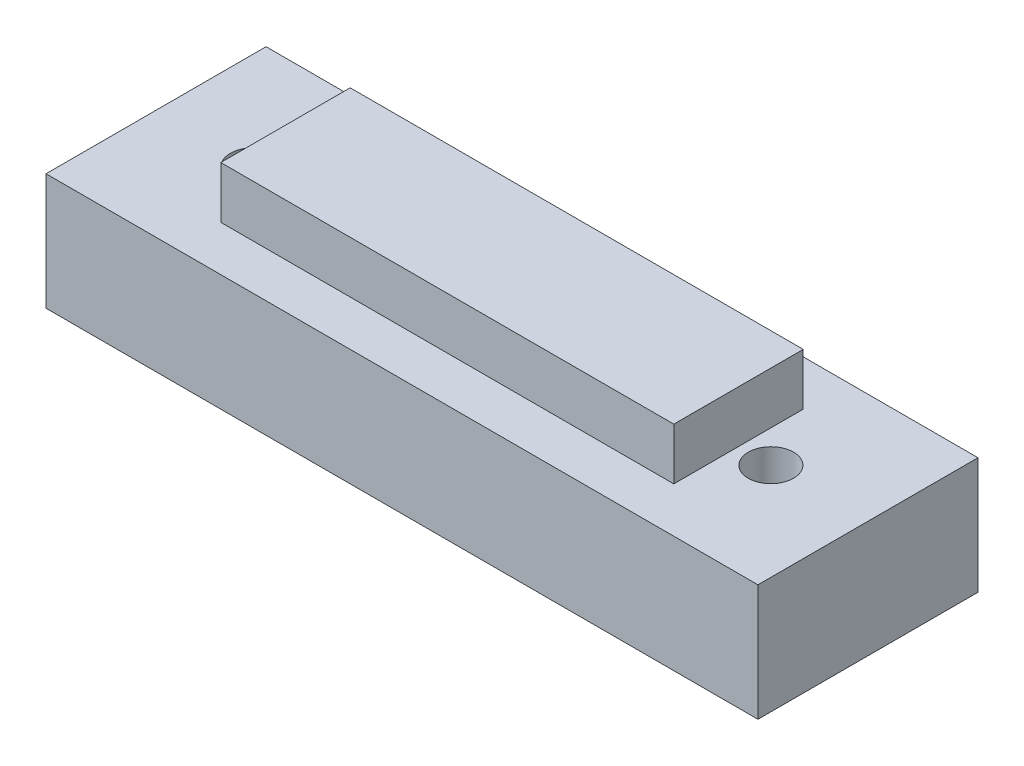
ISO-10303-21;
HEADER;
FILE_DESCRIPTION(('STEP AP214'),'2;1');
FILE_NAME('part.step','',(''),(''),'','','');
FILE_SCHEMA(('AUTOMOTIVE_DESIGN { 1 0 10303 214 1 1 1 1 }'));
ENDSEC;
DATA;
#1=APPLICATION_CONTEXT('core data for automotive mechanical design processes');
#2=APPLICATION_PROTOCOL_DEFINITION('international standard','automotive_design',2000,#1);
#3=PRODUCT_CONTEXT('',#1,'mechanical');
#4=PRODUCT('Part','Part','',(#3));
#5=PRODUCT_RELATED_PRODUCT_CATEGORY('part','',(#4));
#6=PRODUCT_DEFINITION_FORMATION('','',#4);
#7=PRODUCT_DEFINITION_CONTEXT('part definition',#1,'design');
#8=PRODUCT_DEFINITION('design','',#6,#7);
#9=PRODUCT_DEFINITION_SHAPE('','',#8);
#10=(LENGTH_UNIT() NAMED_UNIT(*) SI_UNIT(.MILLI.,.METRE.));
#11=(NAMED_UNIT(*) PLANE_ANGLE_UNIT() SI_UNIT($,.RADIAN.));
#12=(NAMED_UNIT(*) SI_UNIT($,.STERADIAN.) SOLID_ANGLE_UNIT());
#13=UNCERTAINTY_MEASURE_WITH_UNIT(LENGTH_MEASURE(1.E-05),#10,'distance_accuracy_value','');
#14=(GEOMETRIC_REPRESENTATION_CONTEXT(3) GLOBAL_UNCERTAINTY_ASSIGNED_CONTEXT((#13)) GLOBAL_UNIT_ASSIGNED_CONTEXT((#10,
#11,#12)) REPRESENTATION_CONTEXT('',''));
#15=CARTESIAN_POINT('',(0.,0.,0.));
#16=DIRECTION('',(0.,0.,1.));
#17=DIRECTION('',(1.,0.,0.));
#18=AXIS2_PLACEMENT_3D('',#15,#16,#17);
#19=CARTESIAN_POINT('',(0.,18.,0.));
#20=DIRECTION('',(0.,-1.,0.));
#21=DIRECTION('',(0.,0.,-1.));
#22=AXIS2_PLACEMENT_3D('',#19,#20,#21);
#23=PLANE('',#22);
#24=CARTESIAN_POINT('',(40.,18.,0.));
#25=DIRECTION('',(0.,1.,0.));
#26=DIRECTION('',(0.,0.,1.));
#27=AXIS2_PLACEMENT_3D('',#24,#25,#26);
#28=CIRCLE('',#27,3.5);
#29=CARTESIAN_POINT('',(40.,18.,3.5));
#30=VERTEX_POINT('',#29);
#31=EDGE_CURVE('E136',#30,#30,#28,.T.);
#32=ORIENTED_EDGE('',*,*,#31,.F.);
#33=EDGE_LOOP('',(#32));
#34=FACE_BOUND('',#33,.T.);
#35=CARTESIAN_POINT('',(-40.,18.,0.));
#36=DIRECTION('',(0.,1.,0.));
#37=DIRECTION('',(0.,0.,1.));
#38=AXIS2_PLACEMENT_3D('',#35,#36,#37);
#39=CIRCLE('',#38,3.5);
#40=CARTESIAN_POINT('',(-40.,18.,3.5));
#41=VERTEX_POINT('',#40);
#42=EDGE_CURVE('E142',#41,#41,#39,.T.);
#43=ORIENTED_EDGE('',*,*,#42,.F.);
#44=EDGE_LOOP('',(#43));
#45=FACE_BOUND('',#44,.T.);
#46=DIRECTION('',(0.,0.,-1.));
#47=VECTOR('',#46,1.);
#48=CARTESIAN_POINT('',(55.,18.,17.));
#49=LINE('',#48,#47);
#50=CARTESIAN_POINT('',(55.,18.,17.));
#51=VERTEX_POINT('',#50);
#52=CARTESIAN_POINT('',(55.,18.,-17.));
#53=VERTEX_POINT('',#52);
#54=EDGE_CURVE('E148',#51,#53,#49,.T.);
#55=ORIENTED_EDGE('',*,*,#54,.T.);
#56=DIRECTION('',(-1.,0.,0.));
#57=VECTOR('',#56,1.);
#58=CARTESIAN_POINT('',(-55.,18.,-17.));
#59=LINE('',#58,#57);
#60=CARTESIAN_POINT('',(-55.,18.,-17.));
#61=VERTEX_POINT('',#60);
#62=EDGE_CURVE('E151',#53,#61,#59,.T.);
#63=ORIENTED_EDGE('',*,*,#62,.T.);
#64=DIRECTION('',(0.,0.,1.));
#65=VECTOR('',#64,1.);
#66=CARTESIAN_POINT('',(-55.,18.,17.));
#67=LINE('',#66,#65);
#68=CARTESIAN_POINT('',(-55.,18.,17.));
#69=VERTEX_POINT('',#68);
#70=EDGE_CURVE('E154',#61,#69,#67,.T.);
#71=ORIENTED_EDGE('',*,*,#70,.T.);
#72=DIRECTION('',(1.,0.,0.));
#73=VECTOR('',#72,1.);
#74=CARTESIAN_POINT('',(-55.,18.,17.));
#75=LINE('',#74,#73);
#76=EDGE_CURVE('E156',#69,#51,#75,.T.);
#77=ORIENTED_EDGE('',*,*,#76,.T.);
#78=EDGE_LOOP('',(#55,#63,#71,#77));
#79=FACE_BOUND('',#78,.T.);
#80=DIRECTION('',(0.,0.,-1.));
#81=VECTOR('',#80,1.);
#82=CARTESIAN_POINT('',(35.,18.,0.));
#83=LINE('',#82,#81);
#84=CARTESIAN_POINT('',(35.,18.,10.));
#85=VERTEX_POINT('',#84);
#86=CARTESIAN_POINT('',(35.,18.,-10.));
#87=VERTEX_POINT('',#86);
#88=EDGE_CURVE('E123',#85,#87,#83,.T.);
#89=ORIENTED_EDGE('',*,*,#88,.F.);
#90=DIRECTION('',(1.,0.,0.));
#91=VECTOR('',#90,1.);
#92=CARTESIAN_POINT('',(0.,18.,10.));
#93=LINE('',#92,#91);
#94=CARTESIAN_POINT('',(-35.,18.,10.));
#95=VERTEX_POINT('',#94);
#96=EDGE_CURVE('E124',#95,#85,#93,.T.);
#97=ORIENTED_EDGE('',*,*,#96,.F.);
#98=DIRECTION('',(0.,0.,1.));
#99=VECTOR('',#98,1.);
#100=CARTESIAN_POINT('',(-35.,18.,0.));
#101=LINE('',#100,#99);
#102=CARTESIAN_POINT('',(-35.,18.,-10.));
#103=VERTEX_POINT('',#102);
#104=EDGE_CURVE('E59',#103,#95,#101,.T.);
#105=ORIENTED_EDGE('',*,*,#104,.F.);
#106=DIRECTION('',(-1.,0.,0.));
#107=VECTOR('',#106,1.);
#108=CARTESIAN_POINT('',(0.,18.,-10.));
#109=LINE('',#108,#107);
#110=EDGE_CURVE('E54',#87,#103,#109,.T.);
#111=ORIENTED_EDGE('',*,*,#110,.F.);
#112=EDGE_LOOP('',(#89,#97,#105,#111));
#113=FACE_BOUND('',#112,.T.);
#114=ADVANCED_FACE('F39',(#34,#45,#79,#113),#23,.F.);
#115=CARTESIAN_POINT('',(0.,0.,0.));
#116=DIRECTION('',(0.,-1.,0.));
#117=DIRECTION('',(0.,0.,-1.));
#118=AXIS2_PLACEMENT_3D('',#115,#116,#117);
#119=PLANE('',#118);
#120=CARTESIAN_POINT('',(-40.,0.,0.));
#121=DIRECTION('',(0.,1.,0.));
#122=DIRECTION('',(0.,0.,1.));
#123=AXIS2_PLACEMENT_3D('',#120,#121,#122);
#124=CIRCLE('',#123,3.5);
#125=CARTESIAN_POINT('',(-40.,0.,3.5));
#126=VERTEX_POINT('',#125);
#127=EDGE_CURVE('E139',#126,#126,#124,.T.);
#128=ORIENTED_EDGE('',*,*,#127,.T.);
#129=EDGE_LOOP('',(#128));
#130=FACE_BOUND('',#129,.T.);
#131=DIRECTION('',(0.,0.,-1.));
#132=VECTOR('',#131,1.);
#133=CARTESIAN_POINT('',(55.,0.,17.));
#134=LINE('',#133,#132);
#135=CARTESIAN_POINT('',(55.,0.,17.));
#136=VERTEX_POINT('',#135);
#137=CARTESIAN_POINT('',(55.,0.,-17.));
#138=VERTEX_POINT('',#137);
#139=EDGE_CURVE('E145',#136,#138,#134,.T.);
#140=ORIENTED_EDGE('',*,*,#139,.F.);
#141=DIRECTION('',(1.,0.,0.));
#142=VECTOR('',#141,1.);
#143=CARTESIAN_POINT('',(-55.,0.,17.));
#144=LINE('',#143,#142);
#145=CARTESIAN_POINT('',(-55.,0.,17.));
#146=VERTEX_POINT('',#145);
#147=EDGE_CURVE('E152',#146,#136,#144,.T.);
#148=ORIENTED_EDGE('',*,*,#147,.F.);
#149=DIRECTION('',(0.,0.,1.));
#150=VECTOR('',#149,1.);
#151=CARTESIAN_POINT('',(-55.,0.,17.));
#152=LINE('',#151,#150);
#153=CARTESIAN_POINT('',(-55.,0.,-17.));
#154=VERTEX_POINT('',#153);
#155=EDGE_CURVE('E163',#154,#146,#152,.T.);
#156=ORIENTED_EDGE('',*,*,#155,.F.);
#157=DIRECTION('',(-1.,0.,0.));
#158=VECTOR('',#157,1.);
#159=CARTESIAN_POINT('',(-55.,0.,-17.));
#160=LINE('',#159,#158);
#161=EDGE_CURVE('E161',#138,#154,#160,.T.);
#162=ORIENTED_EDGE('',*,*,#161,.F.);
#163=EDGE_LOOP('',(#140,#148,#156,#162));
#164=FACE_BOUND('',#163,.T.);
#165=CARTESIAN_POINT('',(40.,0.,0.));
#166=DIRECTION('',(0.,1.,0.));
#167=DIRECTION('',(0.,0.,1.));
#168=AXIS2_PLACEMENT_3D('',#165,#166,#167);
#169=CIRCLE('',#168,3.5);
#170=CARTESIAN_POINT('',(40.,0.,3.5));
#171=VERTEX_POINT('',#170);
#172=EDGE_CURVE('E135',#171,#171,#169,.T.);
#173=ORIENTED_EDGE('',*,*,#172,.T.);
#174=EDGE_LOOP('',(#173));
#175=FACE_BOUND('',#174,.T.);
#176=ADVANCED_FACE('F181',(#130,#164,#175),#119,.T.);
#177=CARTESIAN_POINT('',(55.,18.,17.));
#178=DIRECTION('',(-1.,0.,0.));
#179=DIRECTION('',(0.,0.,1.));
#180=AXIS2_PLACEMENT_3D('',#177,#178,#179);
#181=PLANE('',#180);
#182=ORIENTED_EDGE('',*,*,#139,.T.);
#183=DIRECTION('',(0.,-1.,0.));
#184=VECTOR('',#183,1.);
#185=CARTESIAN_POINT('',(55.,18.,-17.));
#186=LINE('',#185,#184);
#187=EDGE_CURVE('E11',#53,#138,#186,.T.);
#188=ORIENTED_EDGE('',*,*,#187,.F.);
#189=ORIENTED_EDGE('',*,*,#54,.F.);
#190=DIRECTION('',(0.,-1.,0.));
#191=VECTOR('',#190,1.);
#192=CARTESIAN_POINT('',(55.,18.,17.));
#193=LINE('',#192,#191);
#194=EDGE_CURVE('E158',#51,#136,#193,.T.);
#195=ORIENTED_EDGE('',*,*,#194,.T.);
#196=EDGE_LOOP('',(#182,#188,#189,#195));
#197=FACE_BOUND('',#196,.T.);
#198=ADVANCED_FACE('F41',(#197),#181,.F.);
#199=CARTESIAN_POINT('',(-55.,18.,-17.));
#200=DIRECTION('',(0.,0.,1.));
#201=DIRECTION('',(1.,0.,0.));
#202=AXIS2_PLACEMENT_3D('',#199,#200,#201);
#203=PLANE('',#202);
#204=ORIENTED_EDGE('',*,*,#161,.T.);
#205=DIRECTION('',(0.,-1.,0.));
#206=VECTOR('',#205,1.);
#207=CARTESIAN_POINT('',(-55.,18.,-17.));
#208=LINE('',#207,#206);
#209=EDGE_CURVE('E47',#61,#154,#208,.T.);
#210=ORIENTED_EDGE('',*,*,#209,.F.);
#211=ORIENTED_EDGE('',*,*,#62,.F.);
#212=ORIENTED_EDGE('',*,*,#187,.T.);
#213=EDGE_LOOP('',(#204,#210,#211,#212));
#214=FACE_BOUND('',#213,.T.);
#215=ADVANCED_FACE('F191',(#214),#203,.F.);
#216=CARTESIAN_POINT('',(-55.,18.,17.));
#217=DIRECTION('',(1.,0.,0.));
#218=DIRECTION('',(0.,0.,-1.));
#219=AXIS2_PLACEMENT_3D('',#216,#217,#218);
#220=PLANE('',#219);
#221=ORIENTED_EDGE('',*,*,#155,.T.);
#222=DIRECTION('',(0.,-1.,0.));
#223=VECTOR('',#222,1.);
#224=CARTESIAN_POINT('',(-55.,18.,17.));
#225=LINE('',#224,#223);
#226=EDGE_CURVE('E168',#69,#146,#225,.T.);
#227=ORIENTED_EDGE('',*,*,#226,.F.);
#228=ORIENTED_EDGE('',*,*,#70,.F.);
#229=ORIENTED_EDGE('',*,*,#209,.T.);
#230=EDGE_LOOP('',(#221,#227,#228,#229));
#231=FACE_BOUND('',#230,.T.);
#232=ADVANCED_FACE('F175',(#231),#220,.F.);
#233=CARTESIAN_POINT('',(-55.,18.,17.));
#234=DIRECTION('',(0.,0.,-1.));
#235=DIRECTION('',(-1.,0.,0.));
#236=AXIS2_PLACEMENT_3D('',#233,#234,#235);
#237=PLANE('',#236);
#238=ORIENTED_EDGE('',*,*,#147,.T.);
#239=ORIENTED_EDGE('',*,*,#194,.F.);
#240=ORIENTED_EDGE('',*,*,#76,.F.);
#241=ORIENTED_EDGE('',*,*,#226,.T.);
#242=EDGE_LOOP('',(#238,#239,#240,#241));
#243=FACE_BOUND('',#242,.T.);
#244=ADVANCED_FACE('F185',(#243),#237,.F.);
#245=CARTESIAN_POINT('',(-40.,18.,0.));
#246=DIRECTION('',(0.,-1.,0.));
#247=DIRECTION('',(0.,0.,-1.));
#248=AXIS2_PLACEMENT_3D('',#245,#246,#247);
#249=CYLINDRICAL_SURFACE('',#248,3.5);
#250=ORIENTED_EDGE('',*,*,#42,.T.);
#251=EDGE_LOOP('',(#250));
#252=FACE_BOUND('',#251,.T.);
#253=ORIENTED_EDGE('',*,*,#127,.F.);
#254=EDGE_LOOP('',(#253));
#255=FACE_BOUND('',#254,.T.);
#256=ADVANCED_FACE('F209',(#252,#255),#249,.F.);
#257=CARTESIAN_POINT('',(40.,18.,0.));
#258=DIRECTION('',(0.,-1.,0.));
#259=DIRECTION('',(0.,0.,-1.));
#260=AXIS2_PLACEMENT_3D('',#257,#258,#259);
#261=CYLINDRICAL_SURFACE('',#260,3.5);
#262=ORIENTED_EDGE('',*,*,#31,.T.);
#263=EDGE_LOOP('',(#262));
#264=FACE_BOUND('',#263,.T.);
#265=ORIENTED_EDGE('',*,*,#172,.F.);
#266=EDGE_LOOP('',(#265));
#267=FACE_BOUND('',#266,.T.);
#268=ADVANCED_FACE('F216',(#264,#267),#261,.F.);
#269=CARTESIAN_POINT('',(35.,26.,10.));
#270=DIRECTION('',(-1.,0.,0.));
#271=DIRECTION('',(0.,0.,1.));
#272=AXIS2_PLACEMENT_3D('',#269,#270,#271);
#273=PLANE('',#272);
#274=DIRECTION('',(0.,-1.,0.));
#275=VECTOR('',#274,1.);
#276=CARTESIAN_POINT('',(35.,26.,10.));
#277=LINE('',#276,#275);
#278=CARTESIAN_POINT('',(35.,26.,10.));
#279=VERTEX_POINT('',#278);
#280=EDGE_CURVE('E338',#279,#85,#277,.T.);
#281=ORIENTED_EDGE('',*,*,#280,.T.);
#282=ORIENTED_EDGE('',*,*,#88,.T.);
#283=DIRECTION('',(0.,-1.,0.));
#284=VECTOR('',#283,1.);
#285=CARTESIAN_POINT('',(35.,26.,-10.));
#286=LINE('',#285,#284);
#287=CARTESIAN_POINT('',(35.,26.,-10.));
#288=VERTEX_POINT('',#287);
#289=EDGE_CURVE('E106',#288,#87,#286,.T.);
#290=ORIENTED_EDGE('',*,*,#289,.F.);
#291=DIRECTION('',(0.,0.,-1.));
#292=VECTOR('',#291,1.);
#293=CARTESIAN_POINT('',(35.,26.,10.));
#294=LINE('',#293,#292);
#295=EDGE_CURVE('E112',#279,#288,#294,.T.);
#296=ORIENTED_EDGE('',*,*,#295,.F.);
#297=EDGE_LOOP('',(#281,#282,#290,#296));
#298=FACE_BOUND('',#297,.T.);
#299=ADVANCED_FACE('F122',(#298),#273,.F.);
#300=CARTESIAN_POINT('',(-35.,26.,-10.));
#301=DIRECTION('',(0.,0.,1.));
#302=DIRECTION('',(1.,0.,0.));
#303=AXIS2_PLACEMENT_3D('',#300,#301,#302);
#304=PLANE('',#303);
#305=ORIENTED_EDGE('',*,*,#289,.T.);
#306=ORIENTED_EDGE('',*,*,#110,.T.);
#307=DIRECTION('',(0.,-1.,0.));
#308=VECTOR('',#307,1.);
#309=CARTESIAN_POINT('',(-35.,26.,-10.));
#310=LINE('',#309,#308);
#311=CARTESIAN_POINT('',(-35.,26.,-10.));
#312=VERTEX_POINT('',#311);
#313=EDGE_CURVE('E108',#312,#103,#310,.T.);
#314=ORIENTED_EDGE('',*,*,#313,.F.);
#315=DIRECTION('',(-1.,0.,0.));
#316=VECTOR('',#315,1.);
#317=CARTESIAN_POINT('',(-35.,26.,-10.));
#318=LINE('',#317,#316);
#319=EDGE_CURVE('E102',#288,#312,#318,.T.);
#320=ORIENTED_EDGE('',*,*,#319,.F.);
#321=EDGE_LOOP('',(#305,#306,#314,#320));
#322=FACE_BOUND('',#321,.T.);
#323=ADVANCED_FACE('F104',(#322),#304,.F.);
#324=CARTESIAN_POINT('',(-35.,26.,10.));
#325=DIRECTION('',(1.,0.,0.));
#326=DIRECTION('',(0.,0.,-1.));
#327=AXIS2_PLACEMENT_3D('',#324,#325,#326);
#328=PLANE('',#327);
#329=ORIENTED_EDGE('',*,*,#313,.T.);
#330=ORIENTED_EDGE('',*,*,#104,.T.);
#331=DIRECTION('',(0.,-1.,0.));
#332=VECTOR('',#331,1.);
#333=CARTESIAN_POINT('',(-35.,26.,10.));
#334=LINE('',#333,#332);
#335=CARTESIAN_POINT('',(-35.,26.,10.));
#336=VERTEX_POINT('',#335);
#337=EDGE_CURVE('E128',#336,#95,#334,.T.);
#338=ORIENTED_EDGE('',*,*,#337,.F.);
#339=DIRECTION('',(0.,0.,1.));
#340=VECTOR('',#339,1.);
#341=CARTESIAN_POINT('',(-35.,26.,10.));
#342=LINE('',#341,#340);
#343=EDGE_CURVE('E111',#312,#336,#342,.T.);
#344=ORIENTED_EDGE('',*,*,#343,.F.);
#345=EDGE_LOOP('',(#329,#330,#338,#344));
#346=FACE_BOUND('',#345,.T.);
#347=ADVANCED_FACE('F233',(#346),#328,.F.);
#348=CARTESIAN_POINT('',(-35.,26.,10.));
#349=DIRECTION('',(0.,0.,-1.));
#350=DIRECTION('',(-1.,0.,0.));
#351=AXIS2_PLACEMENT_3D('',#348,#349,#350);
#352=PLANE('',#351);
#353=ORIENTED_EDGE('',*,*,#337,.T.);
#354=ORIENTED_EDGE('',*,*,#96,.T.);
#355=ORIENTED_EDGE('',*,*,#280,.F.);
#356=DIRECTION('',(1.,0.,0.));
#357=VECTOR('',#356,1.);
#358=CARTESIAN_POINT('',(-35.,26.,10.));
#359=LINE('',#358,#357);
#360=EDGE_CURVE('E117',#336,#279,#359,.T.);
#361=ORIENTED_EDGE('',*,*,#360,.F.);
#362=EDGE_LOOP('',(#353,#354,#355,#361));
#363=FACE_BOUND('',#362,.T.);
#364=ADVANCED_FACE('F236',(#363),#352,.F.);
#365=CARTESIAN_POINT('',(0.,26.,0.));
#366=DIRECTION('',(0.,-1.,0.));
#367=DIRECTION('',(0.,0.,-1.));
#368=AXIS2_PLACEMENT_3D('',#365,#366,#367);
#369=PLANE('',#368);
#370=ORIENTED_EDGE('',*,*,#295,.T.);
#371=ORIENTED_EDGE('',*,*,#319,.T.);
#372=ORIENTED_EDGE('',*,*,#343,.T.);
#373=ORIENTED_EDGE('',*,*,#360,.T.);
#374=EDGE_LOOP('',(#370,#371,#372,#373));
#375=FACE_BOUND('',#374,.T.);
#376=ADVANCED_FACE('F115',(#375),#369,.F.);
#377=CLOSED_SHELL('',(#114,#176,#198,#215,#232,#244,#256,#268,#299,#323,#347,#364,#376));
#378=MANIFOLD_SOLID_BREP('B2',#377);
#379=ADVANCED_BREP_SHAPE_REPRESENTATION('',(#18,#378),#14);
#380=SHAPE_DEFINITION_REPRESENTATION(#9,#379);
ENDSEC;
END-ISO-10303-21;
